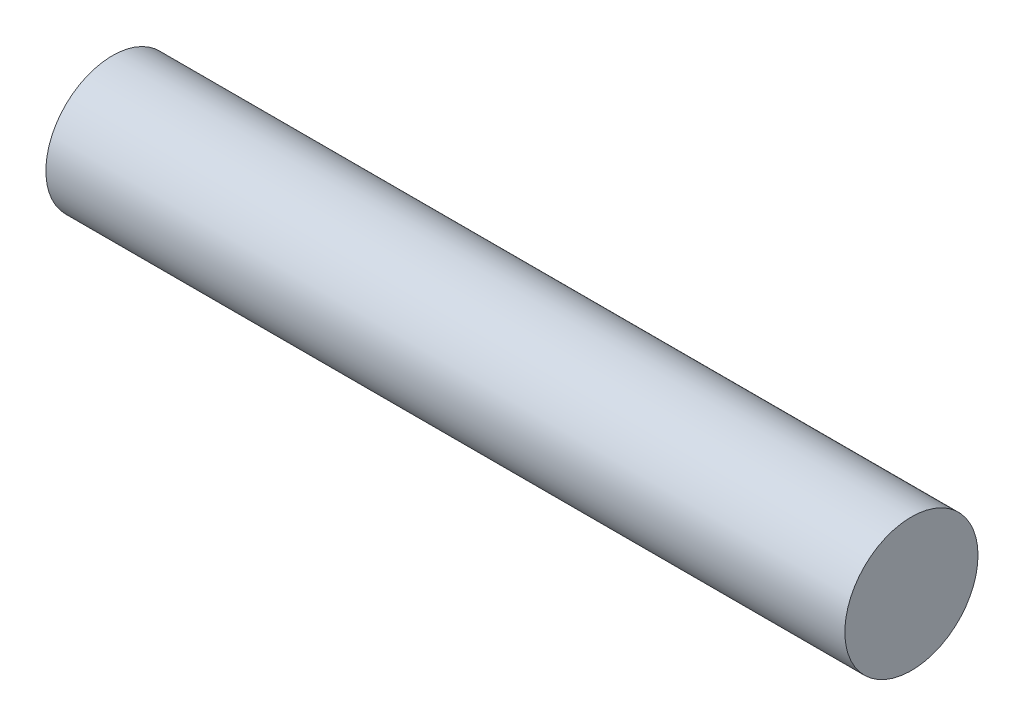
ISO-10303-21;
HEADER;
FILE_DESCRIPTION(('STEP AP214'),'2;1');
FILE_NAME('part.step','',(''),(''),'','','');
FILE_SCHEMA(('AUTOMOTIVE_DESIGN { 1 0 10303 214 1 1 1 1 }'));
ENDSEC;
DATA;
#1=APPLICATION_CONTEXT('core data for automotive mechanical design processes');
#2=APPLICATION_PROTOCOL_DEFINITION('international standard','automotive_design',2000,#1);
#3=PRODUCT_CONTEXT('',#1,'mechanical');
#4=PRODUCT('Part','Part','',(#3));
#5=PRODUCT_RELATED_PRODUCT_CATEGORY('part','',(#4));
#6=PRODUCT_DEFINITION_FORMATION('','',#4);
#7=PRODUCT_DEFINITION_CONTEXT('part definition',#1,'design');
#8=PRODUCT_DEFINITION('design','',#6,#7);
#9=PRODUCT_DEFINITION_SHAPE('','',#8);
#10=(LENGTH_UNIT() NAMED_UNIT(*) SI_UNIT(.MILLI.,.METRE.));
#11=(NAMED_UNIT(*) PLANE_ANGLE_UNIT() SI_UNIT($,.RADIAN.));
#12=(NAMED_UNIT(*) SI_UNIT($,.STERADIAN.) SOLID_ANGLE_UNIT());
#13=UNCERTAINTY_MEASURE_WITH_UNIT(LENGTH_MEASURE(1.E-05),#10,'distance_accuracy_value','');
#14=(GEOMETRIC_REPRESENTATION_CONTEXT(3) GLOBAL_UNCERTAINTY_ASSIGNED_CONTEXT((#13)) GLOBAL_UNIT_ASSIGNED_CONTEXT((#10,
#11,#12)) REPRESENTATION_CONTEXT('',''));
#15=CARTESIAN_POINT('',(0.,0.,0.));
#16=DIRECTION('',(0.,0.,1.));
#17=DIRECTION('',(1.,0.,0.));
#18=AXIS2_PLACEMENT_3D('',#15,#16,#17);
#19=CARTESIAN_POINT('',(-180.,0.,0.));
#20=DIRECTION('',(1.,0.,0.));
#21=DIRECTION('',(0.,0.,-1.));
#22=AXIS2_PLACEMENT_3D('',#19,#20,#21);
#23=CYLINDRICAL_SURFACE('',#22,15.);
#24=CARTESIAN_POINT('',(-180.,0.,0.));
#25=DIRECTION('',(1.,0.,0.));
#26=DIRECTION('',(0.,0.,-1.));
#27=AXIS2_PLACEMENT_3D('',#24,#25,#26);
#28=CIRCLE('',#27,15.);
#29=CARTESIAN_POINT('',(-180.,0.,-15.));
#30=VERTEX_POINT('',#29);
#31=EDGE_CURVE('E10',#30,#30,#28,.T.);
#32=CARTESIAN_POINT('',(0.,0.,0.));
#33=DIRECTION('',(1.,0.,0.));
#34=DIRECTION('',(0.,0.,-1.));
#35=AXIS2_PLACEMENT_3D('',#32,#33,#34);
#36=CIRCLE('',#35,15.);
#37=CARTESIAN_POINT('',(0.,0.,-15.));
#38=VERTEX_POINT('',#37);
#39=EDGE_CURVE('E34',#38,#38,#36,.T.);
#40=CARTESIAN_POINT('',(-180.,0.,-15.));
#41=CARTESIAN_POINT('',(-178.125,0.,-15.));
#42=CARTESIAN_POINT('',(-176.25,0.,-15.));
#43=CARTESIAN_POINT('',(-172.5,0.,-15.));
#44=CARTESIAN_POINT('',(-170.625,0.,-15.));
#45=CARTESIAN_POINT('',(-166.875,0.,-15.));
#46=CARTESIAN_POINT('',(-165.,0.,-15.));
#47=CARTESIAN_POINT('',(-161.25,0.,-15.));
#48=CARTESIAN_POINT('',(-159.375,0.,-15.));
#49=CARTESIAN_POINT('',(-155.625,0.,-15.));
#50=CARTESIAN_POINT('',(-153.75,0.,-15.));
#51=CARTESIAN_POINT('',(-150.,0.,-15.));
#52=CARTESIAN_POINT('',(-148.125,0.,-15.));
#53=CARTESIAN_POINT('',(-144.375,0.,-15.));
#54=CARTESIAN_POINT('',(-142.5,0.,-15.));
#55=CARTESIAN_POINT('',(-138.75,0.,-15.));
#56=CARTESIAN_POINT('',(-136.875,0.,-15.));
#57=CARTESIAN_POINT('',(-133.125,0.,-15.));
#58=CARTESIAN_POINT('',(-131.25,0.,-15.));
#59=CARTESIAN_POINT('',(-127.5,0.,-15.));
#60=CARTESIAN_POINT('',(-125.625,0.,-15.));
#61=CARTESIAN_POINT('',(-121.875,0.,-15.));
#62=CARTESIAN_POINT('',(-120.,0.,-15.));
#63=CARTESIAN_POINT('',(-116.25,0.,-15.));
#64=CARTESIAN_POINT('',(-114.375,0.,-15.));
#65=CARTESIAN_POINT('',(-110.625,0.,-15.));
#66=CARTESIAN_POINT('',(-108.75,0.,-15.));
#67=CARTESIAN_POINT('',(-105.,0.,-15.));
#68=CARTESIAN_POINT('',(-103.125,0.,-15.));
#69=CARTESIAN_POINT('',(-99.375,0.,-15.));
#70=CARTESIAN_POINT('',(-97.5,0.,-15.));
#71=CARTESIAN_POINT('',(-93.75,0.,-15.));
#72=CARTESIAN_POINT('',(-91.875,0.,-15.));
#73=CARTESIAN_POINT('',(-88.125,0.,-15.));
#74=CARTESIAN_POINT('',(-86.25,0.,-15.));
#75=CARTESIAN_POINT('',(-82.5,0.,-15.));
#76=CARTESIAN_POINT('',(-80.625,0.,-15.));
#77=CARTESIAN_POINT('',(-76.875,0.,-15.));
#78=CARTESIAN_POINT('',(-75.,0.,-15.));
#79=CARTESIAN_POINT('',(-71.25,0.,-15.));
#80=CARTESIAN_POINT('',(-69.375,0.,-15.));
#81=CARTESIAN_POINT('',(-65.625,0.,-15.));
#82=CARTESIAN_POINT('',(-63.75,0.,-15.));
#83=CARTESIAN_POINT('',(-60.,0.,-15.));
#84=CARTESIAN_POINT('',(-58.125,0.,-15.));
#85=CARTESIAN_POINT('',(-54.375,0.,-15.));
#86=CARTESIAN_POINT('',(-52.5,0.,-15.));
#87=CARTESIAN_POINT('',(-48.75,0.,-15.));
#88=CARTESIAN_POINT('',(-46.875,0.,-15.));
#89=CARTESIAN_POINT('',(-43.125,0.,-15.));
#90=CARTESIAN_POINT('',(-41.25,0.,-15.));
#91=CARTESIAN_POINT('',(-37.5,0.,-15.));
#92=CARTESIAN_POINT('',(-35.625,0.,-15.));
#93=CARTESIAN_POINT('',(-31.875,0.,-15.));
#94=CARTESIAN_POINT('',(-30.,0.,-15.));
#95=CARTESIAN_POINT('',(-26.25,0.,-15.));
#96=CARTESIAN_POINT('',(-24.375,0.,-15.));
#97=CARTESIAN_POINT('',(-20.625,0.,-15.));
#98=CARTESIAN_POINT('',(-18.75,0.,-15.));
#99=CARTESIAN_POINT('',(-15.,0.,-15.));
#100=CARTESIAN_POINT('',(-13.125,0.,-15.));
#101=CARTESIAN_POINT('',(-9.37500000000003,0.,-15.));
#102=CARTESIAN_POINT('',(-7.50000000000002,0.,-15.));
#103=CARTESIAN_POINT('',(-3.75000000000002,0.,-15.));
#104=CARTESIAN_POINT('',(-1.87500000000003,0.,-15.));
#105=CARTESIAN_POINT('',(0.,0.,-15.));
#106=B_SPLINE_CURVE_WITH_KNOTS('',3,(#40,#41,#42,#43,#44,#45,#46,#47,#48,#49,#50,#51,#52,#53,
#54,#55,#56,#57,#58,#59,#60,#61,#62,#63,#64,#65,#66,#67,#68,#69,#70,#71,#72,#73,#74,#75,#76,#77,
#78,#79,#80,#81,#82,#83,#84,#85,#86,#87,#88,#89,#90,#91,#92,#93,#94,#95,#96,#97,#98,#99,#100,
#101,#102,#103,#104,#105),.UNSPECIFIED.,.F.,.F.,(4,2,2,2,2,2,2,2,2,2,2,2,2,2,2,2,2,2,2,2,2,2,2,
2,2,2,2,2,2,2,2,2,4),(0.,5.62499999999999,11.25,16.875,22.5,28.125,33.75,39.375,45.,50.625,
56.25,61.875,67.5,73.125,78.75,84.375,90.,95.625,101.25,106.875,112.5,118.125,123.75,129.375,
135.,140.625,146.25,151.875,157.5,163.125,168.75,174.375,180.),.UNSPECIFIED.);
#107=EDGE_CURVE('BSEAM31',#30,#38,#106,.T.);
#108=ORIENTED_EDGE('',*,*,#31,.T.);
#109=ORIENTED_EDGE('',*,*,#39,.F.);
#110=ORIENTED_EDGE('',*,*,#107,.T.);
#111=ORIENTED_EDGE('',*,*,#107,.F.);
#112=EDGE_LOOP('',(#108,#110,#109,#111));
#113=FACE_BOUND('',#112,.T.);
#114=ADVANCED_FACE('F31',(#113),#23,.T.);
#115=CARTESIAN_POINT('',(-180.,0.,0.));
#116=DIRECTION('',(1.,0.,0.));
#117=DIRECTION('',(0.,0.,-1.));
#118=AXIS2_PLACEMENT_3D('',#115,#116,#117);
#119=PLANE('',#118);
#120=ORIENTED_EDGE('',*,*,#31,.F.);
#121=EDGE_LOOP('',(#120));
#122=FACE_BOUND('',#121,.T.);
#123=ADVANCED_FACE('F46',(#122),#119,.F.);
#124=CARTESIAN_POINT('',(0.,0.,0.));
#125=DIRECTION('',(1.,0.,0.));
#126=DIRECTION('',(0.,0.,-1.));
#127=AXIS2_PLACEMENT_3D('',#124,#125,#126);
#128=PLANE('',#127);
#129=ORIENTED_EDGE('',*,*,#39,.T.);
#130=EDGE_LOOP('',(#129));
#131=FACE_BOUND('',#130,.T.);
#132=ADVANCED_FACE('F43',(#131),#128,.T.);
#133=CLOSED_SHELL('',(#114,#123,#132));
#134=MANIFOLD_SOLID_BREP('B2',#133);
#135=ADVANCED_BREP_SHAPE_REPRESENTATION('',(#18,#134),#14);
#136=SHAPE_DEFINITION_REPRESENTATION(#9,#135);
ENDSEC;
END-ISO-10303-21;
